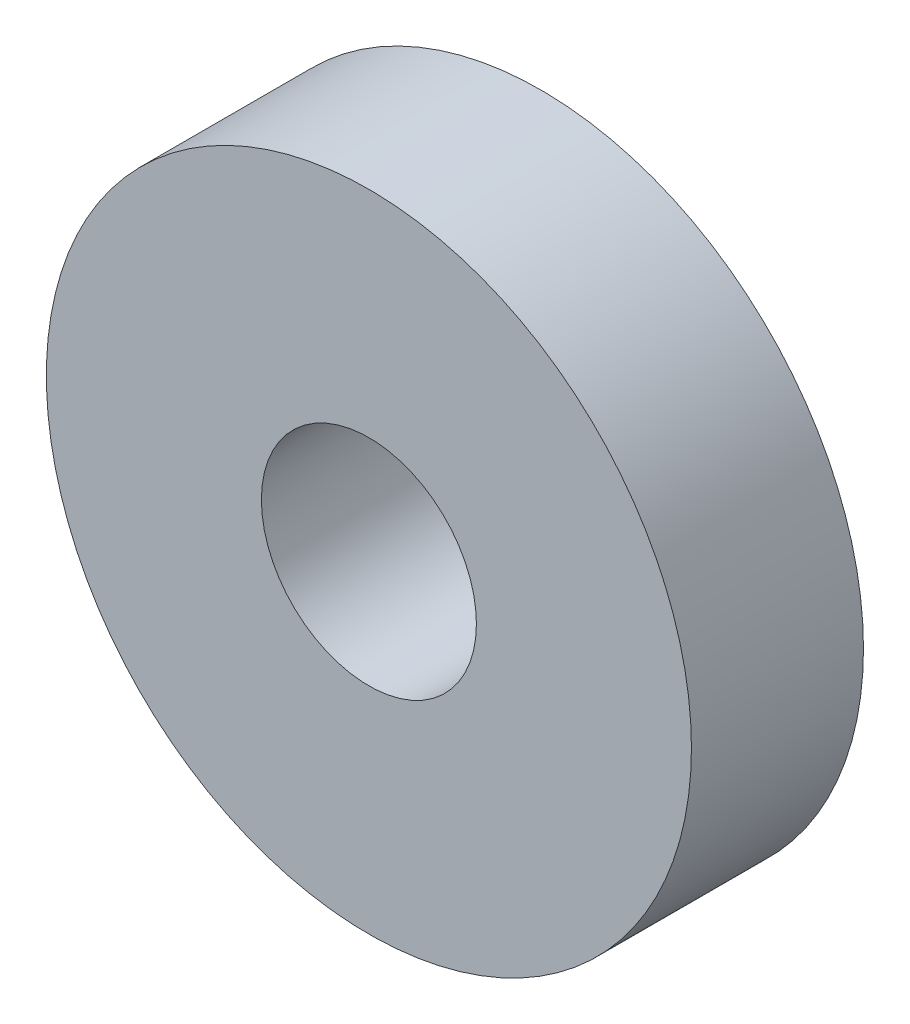
ISO-10303-21;
HEADER;
FILE_DESCRIPTION(('STEP AP214'),'2;1');
FILE_NAME('part.step','',(''),(''),'','','');
FILE_SCHEMA(('AUTOMOTIVE_DESIGN { 1 0 10303 214 1 1 1 1 }'));
ENDSEC;
DATA;
#1=APPLICATION_CONTEXT('core data for automotive mechanical design processes');
#2=APPLICATION_PROTOCOL_DEFINITION('international standard','automotive_design',2000,#1);
#3=PRODUCT_CONTEXT('',#1,'mechanical');
#4=PRODUCT('Part','Part','',(#3));
#5=PRODUCT_RELATED_PRODUCT_CATEGORY('part','',(#4));
#6=PRODUCT_DEFINITION_FORMATION('','',#4);
#7=PRODUCT_DEFINITION_CONTEXT('part definition',#1,'design');
#8=PRODUCT_DEFINITION('design','',#6,#7);
#9=PRODUCT_DEFINITION_SHAPE('','',#8);
#10=(LENGTH_UNIT() NAMED_UNIT(*) SI_UNIT(.MILLI.,.METRE.));
#11=(NAMED_UNIT(*) PLANE_ANGLE_UNIT() SI_UNIT($,.RADIAN.));
#12=(NAMED_UNIT(*) SI_UNIT($,.STERADIAN.) SOLID_ANGLE_UNIT());
#13=UNCERTAINTY_MEASURE_WITH_UNIT(LENGTH_MEASURE(1.E-05),#10,'distance_accuracy_value','');
#14=(GEOMETRIC_REPRESENTATION_CONTEXT(3) GLOBAL_UNCERTAINTY_ASSIGNED_CONTEXT((#13)) GLOBAL_UNIT_ASSIGNED_CONTEXT((#10,
#11,#12)) REPRESENTATION_CONTEXT('',''));
#15=CARTESIAN_POINT('',(0.,0.,0.));
#16=DIRECTION('',(0.,0.,1.));
#17=DIRECTION('',(1.,0.,0.));
#18=AXIS2_PLACEMENT_3D('',#15,#16,#17);
#19=CARTESIAN_POINT('',(0.,0.,4.));
#20=DIRECTION('',(0.,0.,1.));
#21=DIRECTION('',(1.,0.,0.));
#22=AXIS2_PLACEMENT_3D('',#19,#20,#21);
#23=PLANE('',#22);
#24=CARTESIAN_POINT('',(0.,0.,4.));
#25=DIRECTION('',(0.,0.,1.));
#26=DIRECTION('',(1.,0.,0.));
#27=AXIS2_PLACEMENT_3D('',#24,#25,#26);
#28=CIRCLE('',#27,7.5);
#29=CARTESIAN_POINT('',(7.5,0.,4.));
#30=VERTEX_POINT('',#29);
#31=EDGE_CURVE('E10',#30,#30,#28,.T.);
#32=ORIENTED_EDGE('',*,*,#31,.T.);
#33=EDGE_LOOP('',(#32));
#34=FACE_BOUND('',#33,.T.);
#35=CARTESIAN_POINT('',(0.,0.,4.));
#36=DIRECTION('',(0.,0.,1.));
#37=DIRECTION('',(1.,0.,0.));
#38=AXIS2_PLACEMENT_3D('',#35,#36,#37);
#39=CIRCLE('',#38,2.5);
#40=CARTESIAN_POINT('',(2.5,0.,4.));
#41=VERTEX_POINT('',#40);
#42=EDGE_CURVE('E50',#41,#41,#39,.T.);
#43=ORIENTED_EDGE('',*,*,#42,.F.);
#44=EDGE_LOOP('',(#43));
#45=FACE_BOUND('',#44,.T.);
#46=ADVANCED_FACE('F39',(#34,#45),#23,.T.);
#47=CARTESIAN_POINT('',(0.,0.,0.));
#48=DIRECTION('',(0.,0.,1.));
#49=DIRECTION('',(1.,0.,0.));
#50=AXIS2_PLACEMENT_3D('',#47,#48,#49);
#51=PLANE('',#50);
#52=CARTESIAN_POINT('',(0.,0.,0.));
#53=DIRECTION('',(0.,0.,1.));
#54=DIRECTION('',(1.,0.,0.));
#55=AXIS2_PLACEMENT_3D('',#52,#53,#54);
#56=CIRCLE('',#55,7.5);
#57=CARTESIAN_POINT('',(7.5,0.,0.));
#58=VERTEX_POINT('',#57);
#59=EDGE_CURVE('E43',#58,#58,#56,.T.);
#60=ORIENTED_EDGE('',*,*,#59,.F.);
#61=EDGE_LOOP('',(#60));
#62=FACE_BOUND('',#61,.T.);
#63=CARTESIAN_POINT('',(0.,0.,0.));
#64=DIRECTION('',(0.,0.,1.));
#65=DIRECTION('',(1.,0.,0.));
#66=AXIS2_PLACEMENT_3D('',#63,#64,#65);
#67=CIRCLE('',#66,2.5);
#68=CARTESIAN_POINT('',(2.5,0.,0.));
#69=VERTEX_POINT('',#68);
#70=EDGE_CURVE('E52',#69,#69,#67,.T.);
#71=ORIENTED_EDGE('',*,*,#70,.T.);
#72=EDGE_LOOP('',(#71));
#73=FACE_BOUND('',#72,.T.);
#74=ADVANCED_FACE('F62',(#62,#73),#51,.F.);
#75=CARTESIAN_POINT('',(0.,0.,4.));
#76=DIRECTION('',(0.,0.,-1.));
#77=DIRECTION('',(-1.,0.,0.));
#78=AXIS2_PLACEMENT_3D('',#75,#76,#77);
#79=CYLINDRICAL_SURFACE('',#78,7.5);
#80=ORIENTED_EDGE('',*,*,#31,.F.);
#81=EDGE_LOOP('',(#80));
#82=FACE_BOUND('',#81,.T.);
#83=ORIENTED_EDGE('',*,*,#59,.T.);
#84=EDGE_LOOP('',(#83));
#85=FACE_BOUND('',#84,.T.);
#86=ADVANCED_FACE('F41',(#82,#85),#79,.T.);
#87=CARTESIAN_POINT('',(0.,0.,4.));
#88=DIRECTION('',(0.,0.,-1.));
#89=DIRECTION('',(-1.,0.,0.));
#90=AXIS2_PLACEMENT_3D('',#87,#88,#89);
#91=CYLINDRICAL_SURFACE('',#90,2.5);
#92=ORIENTED_EDGE('',*,*,#42,.T.);
#93=EDGE_LOOP('',(#92));
#94=FACE_BOUND('',#93,.T.);
#95=ORIENTED_EDGE('',*,*,#70,.F.);
#96=EDGE_LOOP('',(#95));
#97=FACE_BOUND('',#96,.T.);
#98=ADVANCED_FACE('F58',(#94,#97),#91,.F.);
#99=CLOSED_SHELL('',(#46,#74,#86,#98));
#100=MANIFOLD_SOLID_BREP('B2',#99);
#101=ADVANCED_BREP_SHAPE_REPRESENTATION('',(#18,#100),#14);
#102=SHAPE_DEFINITION_REPRESENTATION(#9,#101);
ENDSEC;
END-ISO-10303-21;
